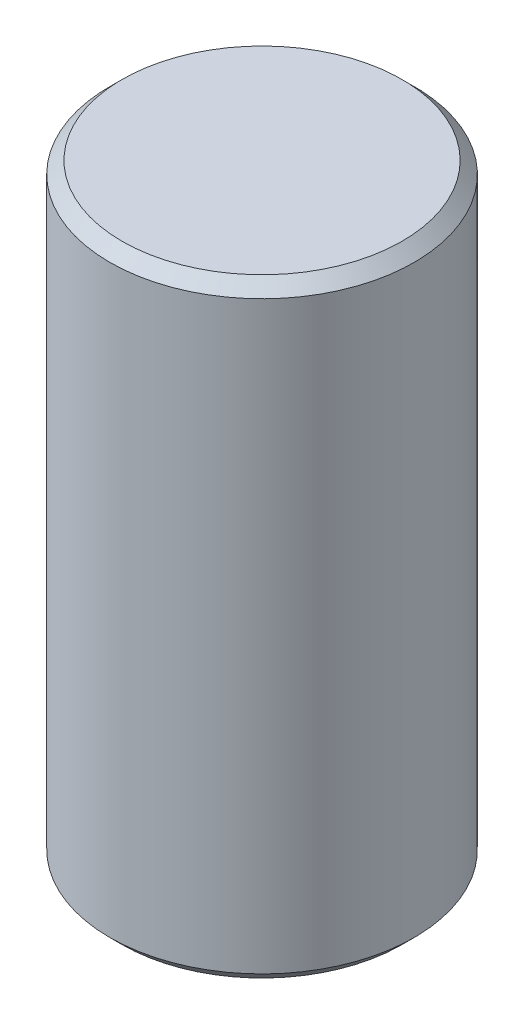
ISO-10303-21;
HEADER;
FILE_DESCRIPTION(('STEP AP214'),'2;1');
FILE_NAME('part.step','',(''),(''),'','','');
FILE_SCHEMA(('AUTOMOTIVE_DESIGN { 1 0 10303 214 1 1 1 1 }'));
ENDSEC;
DATA;
#1=APPLICATION_CONTEXT('core data for automotive mechanical design processes');
#2=APPLICATION_PROTOCOL_DEFINITION('international standard','automotive_design',2000,#1);
#3=PRODUCT_CONTEXT('',#1,'mechanical');
#4=PRODUCT('Part','Part','',(#3));
#5=PRODUCT_RELATED_PRODUCT_CATEGORY('part','',(#4));
#6=PRODUCT_DEFINITION_FORMATION('','',#4);
#7=PRODUCT_DEFINITION_CONTEXT('part definition',#1,'design');
#8=PRODUCT_DEFINITION('design','',#6,#7);
#9=PRODUCT_DEFINITION_SHAPE('','',#8);
#10=(LENGTH_UNIT() NAMED_UNIT(*) SI_UNIT(.MILLI.,.METRE.));
#11=(NAMED_UNIT(*) PLANE_ANGLE_UNIT() SI_UNIT($,.RADIAN.));
#12=(NAMED_UNIT(*) SI_UNIT($,.STERADIAN.) SOLID_ANGLE_UNIT());
#13=UNCERTAINTY_MEASURE_WITH_UNIT(LENGTH_MEASURE(1.E-05),#10,'distance_accuracy_value','');
#14=(GEOMETRIC_REPRESENTATION_CONTEXT(3) GLOBAL_UNCERTAINTY_ASSIGNED_CONTEXT((#13)) GLOBAL_UNIT_ASSIGNED_CONTEXT((#10,
#11,#12)) REPRESENTATION_CONTEXT('',''));
#15=CARTESIAN_POINT('',(0.,0.,0.));
#16=DIRECTION('',(0.,0.,1.));
#17=DIRECTION('',(1.,0.,0.));
#18=AXIS2_PLACEMENT_3D('',#15,#16,#17);
#19=CARTESIAN_POINT('',(0.,2.5,0.));
#20=DIRECTION('',(0.,-1.,0.));
#21=DIRECTION('',(0.,0.,-1.));
#22=AXIS2_PLACEMENT_3D('',#19,#20,#21);
#23=CYLINDRICAL_SURFACE('',#22,1.25);
#24=CARTESIAN_POINT('',(0.,-2.4,0.));
#25=DIRECTION('',(0.,1.,0.));
#26=DIRECTION('',(0.,0.,1.));
#27=AXIS2_PLACEMENT_3D('',#24,#25,#26);
#28=CIRCLE('',#27,1.25);
#29=CARTESIAN_POINT('',(0.,-2.4,1.25));
#30=VERTEX_POINT('',#29);
#31=EDGE_CURVE('E47',#30,#30,#28,.T.);
#32=ORIENTED_EDGE('',*,*,#31,.T.);
#33=EDGE_LOOP('',(#32));
#34=FACE_BOUND('',#33,.T.);
#35=CARTESIAN_POINT('',(0.,2.4,0.));
#36=DIRECTION('',(0.,1.,0.));
#37=DIRECTION('',(0.,0.,1.));
#38=AXIS2_PLACEMENT_3D('',#35,#36,#37);
#39=CIRCLE('',#38,1.25);
#40=CARTESIAN_POINT('',(0.,2.4,1.25));
#41=VERTEX_POINT('',#40);
#42=EDGE_CURVE('E51',#41,#41,#39,.F.);
#43=ORIENTED_EDGE('',*,*,#42,.T.);
#44=EDGE_LOOP('',(#43));
#45=FACE_BOUND('',#44,.T.);
#46=ADVANCED_FACE('F35',(#34,#45),#23,.T.);
#47=CARTESIAN_POINT('',(0.,2.5,0.));
#48=DIRECTION('',(0.,1.,0.));
#49=DIRECTION('',(0.,0.,1.));
#50=AXIS2_PLACEMENT_3D('',#47,#48,#49);
#51=PLANE('',#50);
#52=CARTESIAN_POINT('',(0.,2.5,0.));
#53=DIRECTION('',(0.,1.,0.));
#54=DIRECTION('',(0.,0.,1.));
#55=AXIS2_PLACEMENT_3D('',#52,#53,#54);
#56=CIRCLE('',#55,1.15);
#57=CARTESIAN_POINT('',(0.,2.5,1.15));
#58=VERTEX_POINT('',#57);
#59=EDGE_CURVE('E10',#58,#58,#56,.T.);
#60=ORIENTED_EDGE('',*,*,#59,.T.);
#61=EDGE_LOOP('',(#60));
#62=FACE_BOUND('',#61,.T.);
#63=ADVANCED_FACE('F67',(#62),#51,.T.);
#64=CARTESIAN_POINT('',(0.,-2.5,0.));
#65=DIRECTION('',(0.,1.,0.));
#66=DIRECTION('',(0.,0.,1.));
#67=AXIS2_PLACEMENT_3D('',#64,#65,#66);
#68=PLANE('',#67);
#69=CARTESIAN_POINT('',(0.,-2.5,0.));
#70=DIRECTION('',(0.,1.,0.));
#71=DIRECTION('',(0.,0.,1.));
#72=AXIS2_PLACEMENT_3D('',#69,#70,#71);
#73=CIRCLE('',#72,1.15);
#74=CARTESIAN_POINT('',(0.,-2.5,1.15));
#75=VERTEX_POINT('',#74);
#76=EDGE_CURVE('E43',#75,#75,#73,.F.);
#77=ORIENTED_EDGE('',*,*,#76,.T.);
#78=EDGE_LOOP('',(#77));
#79=FACE_BOUND('',#78,.T.);
#80=ADVANCED_FACE('F64',(#79),#68,.F.);
#81=CARTESIAN_POINT('',(0.,-2.4,0.));
#82=DIRECTION('',(0.,1.,0.));
#83=DIRECTION('',(0.,0.,1.));
#84=AXIS2_PLACEMENT_3D('',#81,#82,#83);
#85=CONICAL_SURFACE('',#84,1.25,0.78539816339745);
#86=ORIENTED_EDGE('',*,*,#76,.F.);
#87=EDGE_LOOP('',(#86));
#88=FACE_BOUND('',#87,.T.);
#89=ORIENTED_EDGE('',*,*,#31,.F.);
#90=EDGE_LOOP('',(#89));
#91=FACE_BOUND('',#90,.T.);
#92=ADVANCED_FACE('F60',(#88,#91),#85,.T.);
#93=CARTESIAN_POINT('',(0.,2.5,0.));
#94=DIRECTION('',(0.,-1.,0.));
#95=DIRECTION('',(0.,0.,-1.));
#96=AXIS2_PLACEMENT_3D('',#93,#94,#95);
#97=CONICAL_SURFACE('',#96,1.15,0.78539816339744);
#98=ORIENTED_EDGE('',*,*,#42,.F.);
#99=EDGE_LOOP('',(#98));
#100=FACE_BOUND('',#99,.T.);
#101=ORIENTED_EDGE('',*,*,#59,.F.);
#102=EDGE_LOOP('',(#101));
#103=FACE_BOUND('',#102,.T.);
#104=ADVANCED_FACE('F38',(#100,#103),#97,.T.);
#105=CLOSED_SHELL('',(#46,#63,#80,#92,#104));
#106=MANIFOLD_SOLID_BREP('B2',#105);
#107=ADVANCED_BREP_SHAPE_REPRESENTATION('',(#18,#106),#14);
#108=SHAPE_DEFINITION_REPRESENTATION(#9,#107);
ENDSEC;
END-ISO-10303-21;
